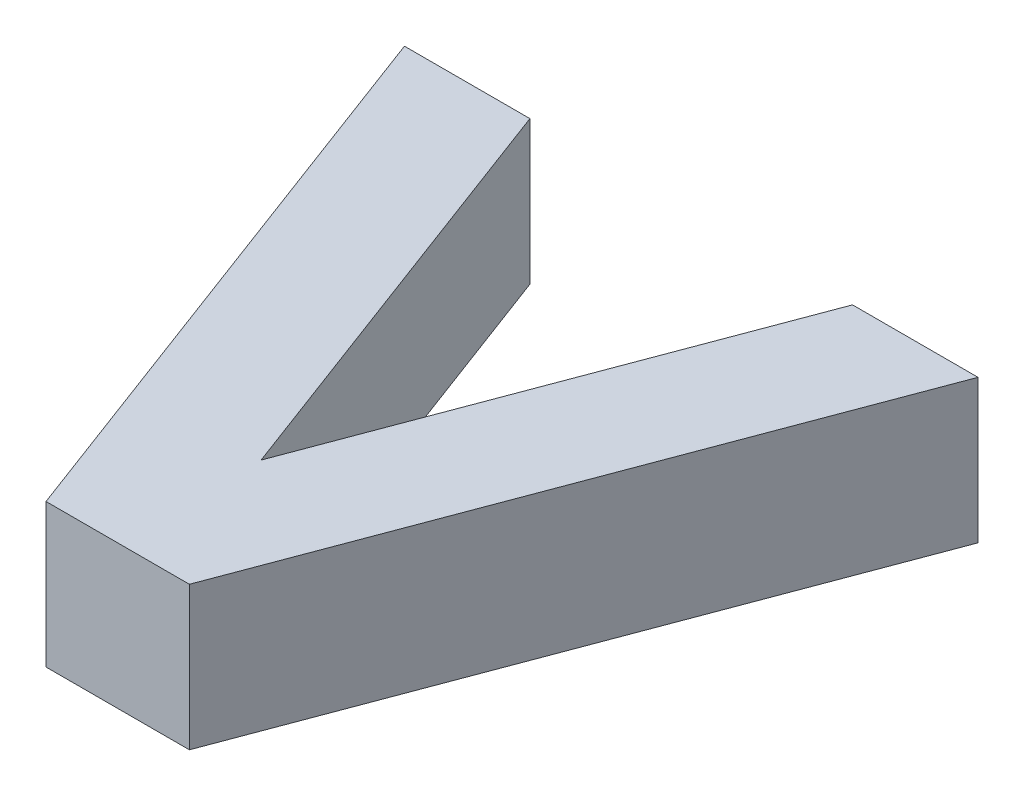
ISO-10303-21;
HEADER;
FILE_DESCRIPTION(('STEP AP214'),'2;1');
FILE_NAME('part.step','',(''),(''),'','','');
FILE_SCHEMA(('AUTOMOTIVE_DESIGN { 1 0 10303 214 1 1 1 1 }'));
ENDSEC;
DATA;
#1=APPLICATION_CONTEXT('core data for automotive mechanical design processes');
#2=APPLICATION_PROTOCOL_DEFINITION('international standard','automotive_design',2000,#1);
#3=PRODUCT_CONTEXT('',#1,'mechanical');
#4=PRODUCT('Part','Part','',(#3));
#5=PRODUCT_RELATED_PRODUCT_CATEGORY('part','',(#4));
#6=PRODUCT_DEFINITION_FORMATION('','',#4);
#7=PRODUCT_DEFINITION_CONTEXT('part definition',#1,'design');
#8=PRODUCT_DEFINITION('design','',#6,#7);
#9=PRODUCT_DEFINITION_SHAPE('','',#8);
#10=(LENGTH_UNIT() NAMED_UNIT(*) SI_UNIT(.MILLI.,.METRE.));
#11=(NAMED_UNIT(*) PLANE_ANGLE_UNIT() SI_UNIT($,.RADIAN.));
#12=(NAMED_UNIT(*) SI_UNIT($,.STERADIAN.) SOLID_ANGLE_UNIT());
#13=UNCERTAINTY_MEASURE_WITH_UNIT(LENGTH_MEASURE(1.E-05),#10,'distance_accuracy_value','');
#14=(GEOMETRIC_REPRESENTATION_CONTEXT(3) GLOBAL_UNCERTAINTY_ASSIGNED_CONTEXT((#13)) GLOBAL_UNIT_ASSIGNED_CONTEXT((#10,
#11,#12)) REPRESENTATION_CONTEXT('',''));
#15=CARTESIAN_POINT('',(0.,0.,0.));
#16=DIRECTION('',(0.,0.,1.));
#17=DIRECTION('',(1.,0.,0.));
#18=AXIS2_PLACEMENT_3D('',#15,#16,#17);
#19=CARTESIAN_POINT('',(-2.5,5.,0.));
#20=DIRECTION('',(0.,0.,-1.));
#21=DIRECTION('',(-1.,0.,0.));
#22=AXIS2_PLACEMENT_3D('',#19,#20,#21);
#23=PLANE('',#22);
#24=DIRECTION('',(1.,0.,0.));
#25=VECTOR('',#24,1.);
#26=CARTESIAN_POINT('',(-2.5,0.,0.));
#27=LINE('',#26,#25);
#28=CARTESIAN_POINT('',(-2.5,0.,0.));
#29=VERTEX_POINT('',#28);
#30=CARTESIAN_POINT('',(2.5,0.,0.));
#31=VERTEX_POINT('',#30);
#32=EDGE_CURVE('E123',#29,#31,#27,.T.);
#33=ORIENTED_EDGE('',*,*,#32,.T.);
#34=DIRECTION('',(0.,-1.,0.));
#35=VECTOR('',#34,1.);
#36=CARTESIAN_POINT('',(2.5,5.,0.));
#37=LINE('',#36,#35);
#38=CARTESIAN_POINT('',(2.5,5.,0.));
#39=VERTEX_POINT('',#38);
#40=EDGE_CURVE('E11',#39,#31,#37,.T.);
#41=ORIENTED_EDGE('',*,*,#40,.F.);
#42=DIRECTION('',(1.,0.,0.));
#43=VECTOR('',#42,1.);
#44=CARTESIAN_POINT('',(-2.5,5.,0.));
#45=LINE('',#44,#43);
#46=CARTESIAN_POINT('',(-2.5,5.,0.));
#47=VERTEX_POINT('',#46);
#48=EDGE_CURVE('E138',#47,#39,#45,.T.);
#49=ORIENTED_EDGE('',*,*,#48,.F.);
#50=DIRECTION('',(0.,-1.,0.));
#51=VECTOR('',#50,1.);
#52=CARTESIAN_POINT('',(-2.5,5.,0.));
#53=LINE('',#52,#51);
#54=EDGE_CURVE('E49',#47,#29,#53,.T.);
#55=ORIENTED_EDGE('',*,*,#54,.T.);
#56=EDGE_LOOP('',(#33,#41,#49,#55));
#57=FACE_BOUND('',#56,.T.);
#58=ADVANCED_FACE('F33',(#57),#23,.F.);
#59=CARTESIAN_POINT('',(2.5,5.,0.));
#60=DIRECTION('',(-0.936329177569045,0.,-0.351123441588392));
#61=DIRECTION('',(-0.351123441588392,0.,0.936329177569045));
#62=AXIS2_PLACEMENT_3D('',#59,#60,#61);
#63=PLANE('',#62);
#64=DIRECTION('',(0.351123441588392,0.,-0.936329177569045));
#65=VECTOR('',#64,1.);
#66=CARTESIAN_POINT('',(2.5,0.,0.));
#67=LINE('',#66,#65);
#68=CARTESIAN_POINT('',(10.,0.,-20.));
#69=VERTEX_POINT('',#68);
#70=EDGE_CURVE('E125',#31,#69,#67,.T.);
#71=ORIENTED_EDGE('',*,*,#70,.T.);
#72=DIRECTION('',(0.,-1.,0.));
#73=VECTOR('',#72,1.);
#74=CARTESIAN_POINT('',(10.,5.,-20.));
#75=LINE('',#74,#73);
#76=CARTESIAN_POINT('',(10.,5.,-20.));
#77=VERTEX_POINT('',#76);
#78=EDGE_CURVE('E41',#77,#69,#75,.T.);
#79=ORIENTED_EDGE('',*,*,#78,.F.);
#80=DIRECTION('',(0.351123441588392,0.,-0.936329177569045));
#81=VECTOR('',#80,1.);
#82=CARTESIAN_POINT('',(2.5,5.,0.));
#83=LINE('',#82,#81);
#84=EDGE_CURVE('E84',#39,#77,#83,.T.);
#85=ORIENTED_EDGE('',*,*,#84,.F.);
#86=ORIENTED_EDGE('',*,*,#40,.T.);
#87=EDGE_LOOP('',(#71,#79,#85,#86));
#88=FACE_BOUND('',#87,.T.);
#89=ADVANCED_FACE('F160',(#88),#63,.F.);
#90=CARTESIAN_POINT('',(10.,5.,-20.));
#91=DIRECTION('',(0.,0.,1.));
#92=DIRECTION('',(1.,0.,0.));
#93=AXIS2_PLACEMENT_3D('',#90,#91,#92);
#94=PLANE('',#93);
#95=DIRECTION('',(-1.,0.,0.));
#96=VECTOR('',#95,1.);
#97=CARTESIAN_POINT('',(10.,0.,-20.));
#98=LINE('',#97,#96);
#99=CARTESIAN_POINT('',(5.625,0.,-20.));
#100=VERTEX_POINT('',#99);
#101=EDGE_CURVE('E127',#69,#100,#98,.T.);
#102=ORIENTED_EDGE('',*,*,#101,.T.);
#103=DIRECTION('',(0.,-1.,0.));
#104=VECTOR('',#103,1.);
#105=CARTESIAN_POINT('',(5.625,5.,-20.));
#106=LINE('',#105,#104);
#107=CARTESIAN_POINT('',(5.625,5.,-20.));
#108=VERTEX_POINT('',#107);
#109=EDGE_CURVE('E142',#108,#100,#106,.T.);
#110=ORIENTED_EDGE('',*,*,#109,.F.);
#111=DIRECTION('',(-1.,0.,0.));
#112=VECTOR('',#111,1.);
#113=CARTESIAN_POINT('',(10.,5.,-20.));
#114=LINE('',#113,#112);
#115=EDGE_CURVE('E150',#77,#108,#114,.T.);
#116=ORIENTED_EDGE('',*,*,#115,.F.);
#117=ORIENTED_EDGE('',*,*,#78,.T.);
#118=EDGE_LOOP('',(#102,#110,#116,#117));
#119=FACE_BOUND('',#118,.T.);
#120=ADVANCED_FACE('F148',(#119),#94,.F.);
#121=CARTESIAN_POINT('',(5.625,5.,-20.));
#122=DIRECTION('',(0.936329177569045,0.,0.351123441588392));
#123=DIRECTION('',(0.351123441588392,0.,-0.936329177569045));
#124=AXIS2_PLACEMENT_3D('',#121,#122,#123);
#125=PLANE('',#124);
#126=DIRECTION('',(-0.351123441588392,0.,0.936329177569045));
#127=VECTOR('',#126,1.);
#128=CARTESIAN_POINT('',(5.625,0.,-20.));
#129=LINE('',#128,#127);
#130=CARTESIAN_POINT('',(0.,0.,-5.));
#131=VERTEX_POINT('',#130);
#132=EDGE_CURVE('E129',#100,#131,#129,.T.);
#133=ORIENTED_EDGE('',*,*,#132,.T.);
#134=DIRECTION('',(0.,-1.,0.));
#135=VECTOR('',#134,1.);
#136=CARTESIAN_POINT('',(0.,5.,-5.));
#137=LINE('',#136,#135);
#138=CARTESIAN_POINT('',(0.,5.,-5.));
#139=VERTEX_POINT('',#138);
#140=EDGE_CURVE('E106',#139,#131,#137,.T.);
#141=ORIENTED_EDGE('',*,*,#140,.F.);
#142=DIRECTION('',(-0.351123441588392,0.,0.936329177569045));
#143=VECTOR('',#142,1.);
#144=CARTESIAN_POINT('',(5.625,5.,-20.));
#145=LINE('',#144,#143);
#146=EDGE_CURVE('E114',#108,#139,#145,.T.);
#147=ORIENTED_EDGE('',*,*,#146,.F.);
#148=ORIENTED_EDGE('',*,*,#109,.T.);
#149=EDGE_LOOP('',(#133,#141,#147,#148));
#150=FACE_BOUND('',#149,.T.);
#151=ADVANCED_FACE('F155',(#150),#125,.F.);
#152=CARTESIAN_POINT('',(-5.625,5.,-20.));
#153=DIRECTION('',(0.936329177569045,0.,-0.351123441588392));
#154=DIRECTION('',(-0.351123441588392,0.,-0.936329177569045));
#155=AXIS2_PLACEMENT_3D('',#152,#153,#154);
#156=PLANE('',#155);
#157=DIRECTION('',(0.351123441588392,0.,0.936329177569045));
#158=VECTOR('',#157,1.);
#159=CARTESIAN_POINT('',(-5.625,0.,-20.));
#160=LINE('',#159,#158);
#161=CARTESIAN_POINT('',(-5.625,0.,-20.));
#162=VERTEX_POINT('',#161);
#163=EDGE_CURVE('E102',#162,#131,#160,.T.);
#164=ORIENTED_EDGE('',*,*,#163,.F.);
#165=DIRECTION('',(0.,-1.,0.));
#166=VECTOR('',#165,1.);
#167=CARTESIAN_POINT('',(-5.625,5.,-20.));
#168=LINE('',#167,#166);
#169=CARTESIAN_POINT('',(-5.625,5.,-20.));
#170=VERTEX_POINT('',#169);
#171=EDGE_CURVE('E97',#170,#162,#168,.T.);
#172=ORIENTED_EDGE('',*,*,#171,.F.);
#173=DIRECTION('',(0.351123441588392,0.,0.936329177569045));
#174=VECTOR('',#173,1.);
#175=CARTESIAN_POINT('',(-5.625,5.,-20.));
#176=LINE('',#175,#174);
#177=EDGE_CURVE('E100',#170,#139,#176,.T.);
#178=ORIENTED_EDGE('',*,*,#177,.T.);
#179=ORIENTED_EDGE('',*,*,#140,.T.);
#180=EDGE_LOOP('',(#164,#172,#178,#179));
#181=FACE_BOUND('',#180,.T.);
#182=ADVANCED_FACE('F99',(#181),#156,.T.);
#183=CARTESIAN_POINT('',(-10.,5.,-20.));
#184=DIRECTION('',(0.,0.,-1.));
#185=DIRECTION('',(-1.,0.,0.));
#186=AXIS2_PLACEMENT_3D('',#183,#184,#185);
#187=PLANE('',#186);
#188=DIRECTION('',(1.,0.,0.));
#189=VECTOR('',#188,1.);
#190=CARTESIAN_POINT('',(-10.,0.,-20.));
#191=LINE('',#190,#189);
#192=CARTESIAN_POINT('',(-10.,0.,-20.));
#193=VERTEX_POINT('',#192);
#194=EDGE_CURVE('E133',#193,#162,#191,.T.);
#195=ORIENTED_EDGE('',*,*,#194,.F.);
#196=DIRECTION('',(0.,-1.,0.));
#197=VECTOR('',#196,1.);
#198=CARTESIAN_POINT('',(-10.,5.,-20.));
#199=LINE('',#198,#197);
#200=CARTESIAN_POINT('',(-10.,5.,-20.));
#201=VERTEX_POINT('',#200);
#202=EDGE_CURVE('E72',#201,#193,#199,.T.);
#203=ORIENTED_EDGE('',*,*,#202,.F.);
#204=DIRECTION('',(1.,0.,0.));
#205=VECTOR('',#204,1.);
#206=CARTESIAN_POINT('',(-10.,5.,-20.));
#207=LINE('',#206,#205);
#208=EDGE_CURVE('E112',#201,#170,#207,.T.);
#209=ORIENTED_EDGE('',*,*,#208,.T.);
#210=ORIENTED_EDGE('',*,*,#171,.T.);
#211=EDGE_LOOP('',(#195,#203,#209,#210));
#212=FACE_BOUND('',#211,.T.);
#213=ADVANCED_FACE('F117',(#212),#187,.T.);
#214=CARTESIAN_POINT('',(-2.5,5.,0.));
#215=DIRECTION('',(-0.936329177569045,0.,0.351123441588392));
#216=DIRECTION('',(0.351123441588392,0.,0.936329177569045));
#217=AXIS2_PLACEMENT_3D('',#214,#215,#216);
#218=PLANE('',#217);
#219=DIRECTION('',(-0.351123441588392,0.,-0.936329177569045));
#220=VECTOR('',#219,1.);
#221=CARTESIAN_POINT('',(-2.5,0.,0.));
#222=LINE('',#221,#220);
#223=EDGE_CURVE('E135',#29,#193,#222,.T.);
#224=ORIENTED_EDGE('',*,*,#223,.F.);
#225=ORIENTED_EDGE('',*,*,#54,.F.);
#226=DIRECTION('',(-0.351123441588392,0.,-0.936329177569045));
#227=VECTOR('',#226,1.);
#228=CARTESIAN_POINT('',(-2.5,5.,0.));
#229=LINE('',#228,#227);
#230=EDGE_CURVE('E118',#47,#201,#229,.T.);
#231=ORIENTED_EDGE('',*,*,#230,.T.);
#232=ORIENTED_EDGE('',*,*,#202,.T.);
#233=EDGE_LOOP('',(#224,#225,#231,#232));
#234=FACE_BOUND('',#233,.T.);
#235=ADVANCED_FACE('F174',(#234),#218,.T.);
#236=CARTESIAN_POINT('',(0.,5.,0.));
#237=DIRECTION('',(0.,1.,0.));
#238=DIRECTION('',(0.,0.,1.));
#239=AXIS2_PLACEMENT_3D('',#236,#237,#238);
#240=PLANE('',#239);
#241=ORIENTED_EDGE('',*,*,#48,.T.);
#242=ORIENTED_EDGE('',*,*,#84,.T.);
#243=ORIENTED_EDGE('',*,*,#115,.T.);
#244=ORIENTED_EDGE('',*,*,#146,.T.);
#245=ORIENTED_EDGE('',*,*,#177,.F.);
#246=ORIENTED_EDGE('',*,*,#208,.F.);
#247=ORIENTED_EDGE('',*,*,#230,.F.);
#248=EDGE_LOOP('',(#241,#242,#243,#244,#245,#246,#247));
#249=FACE_BOUND('',#248,.T.);
#250=ADVANCED_FACE('F110',(#249),#240,.T.);
#251=CARTESIAN_POINT('',(0.,0.,0.));
#252=DIRECTION('',(0.,1.,0.));
#253=DIRECTION('',(0.,0.,1.));
#254=AXIS2_PLACEMENT_3D('',#251,#252,#253);
#255=PLANE('',#254);
#256=ORIENTED_EDGE('',*,*,#32,.F.);
#257=ORIENTED_EDGE('',*,*,#223,.T.);
#258=ORIENTED_EDGE('',*,*,#194,.T.);
#259=ORIENTED_EDGE('',*,*,#163,.T.);
#260=ORIENTED_EDGE('',*,*,#132,.F.);
#261=ORIENTED_EDGE('',*,*,#101,.F.);
#262=ORIENTED_EDGE('',*,*,#70,.F.);
#263=EDGE_LOOP('',(#256,#257,#258,#259,#260,#261,#262));
#264=FACE_BOUND('',#263,.T.);
#265=ADVANCED_FACE('F153',(#264),#255,.F.);
#266=CLOSED_SHELL('',(#58,#89,#120,#151,#182,#213,#235,#250,#265));
#267=MANIFOLD_SOLID_BREP('B2',#266);
#268=ADVANCED_BREP_SHAPE_REPRESENTATION('',(#18,#267),#14);
#269=SHAPE_DEFINITION_REPRESENTATION(#9,#268);
ENDSEC;
END-ISO-10303-21;
